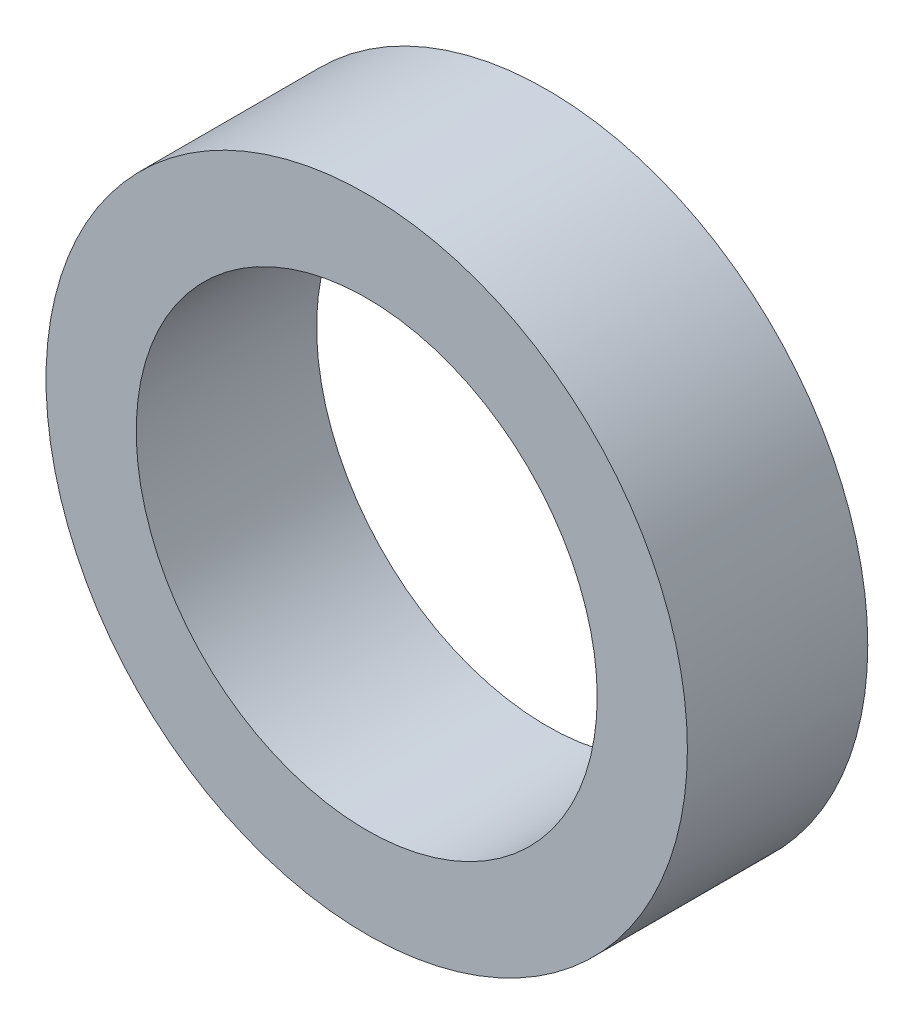
ISO-10303-21;
HEADER;
FILE_DESCRIPTION(('STEP AP214'),'2;1');
FILE_NAME('part.step','',(''),(''),'','','');
FILE_SCHEMA(('AUTOMOTIVE_DESIGN { 1 0 10303 214 1 1 1 1 }'));
ENDSEC;
DATA;
#1=APPLICATION_CONTEXT('core data for automotive mechanical design processes');
#2=APPLICATION_PROTOCOL_DEFINITION('international standard','automotive_design',2000,#1);
#3=PRODUCT_CONTEXT('',#1,'mechanical');
#4=PRODUCT('Part','Part','',(#3));
#5=PRODUCT_RELATED_PRODUCT_CATEGORY('part','',(#4));
#6=PRODUCT_DEFINITION_FORMATION('','',#4);
#7=PRODUCT_DEFINITION_CONTEXT('part definition',#1,'design');
#8=PRODUCT_DEFINITION('design','',#6,#7);
#9=PRODUCT_DEFINITION_SHAPE('','',#8);
#10=(LENGTH_UNIT() NAMED_UNIT(*) SI_UNIT(.MILLI.,.METRE.));
#11=(NAMED_UNIT(*) PLANE_ANGLE_UNIT() SI_UNIT($,.RADIAN.));
#12=(NAMED_UNIT(*) SI_UNIT($,.STERADIAN.) SOLID_ANGLE_UNIT());
#13=UNCERTAINTY_MEASURE_WITH_UNIT(LENGTH_MEASURE(1.E-05),#10,'distance_accuracy_value','');
#14=(GEOMETRIC_REPRESENTATION_CONTEXT(3) GLOBAL_UNCERTAINTY_ASSIGNED_CONTEXT((#13)) GLOBAL_UNIT_ASSIGNED_CONTEXT((#10,
#11,#12)) REPRESENTATION_CONTEXT('',''));
#15=CARTESIAN_POINT('',(0.,0.,0.));
#16=DIRECTION('',(0.,0.,1.));
#17=DIRECTION('',(1.,0.,0.));
#18=AXIS2_PLACEMENT_3D('',#15,#16,#17);
#19=CARTESIAN_POINT('',(0.,0.,9.));
#20=DIRECTION('',(0.,0.,1.));
#21=DIRECTION('',(1.,0.,0.));
#22=AXIS2_PLACEMENT_3D('',#19,#20,#21);
#23=PLANE('',#22);
#24=CARTESIAN_POINT('',(0.,0.,9.));
#25=DIRECTION('',(0.,0.,1.));
#26=DIRECTION('',(1.,0.,0.));
#27=AXIS2_PLACEMENT_3D('',#24,#25,#26);
#28=CIRCLE('',#27,16.);
#29=CARTESIAN_POINT('',(16.,0.,9.));
#30=VERTEX_POINT('',#29);
#31=EDGE_CURVE('E10',#30,#30,#28,.T.);
#32=ORIENTED_EDGE('',*,*,#31,.T.);
#33=EDGE_LOOP('',(#32));
#34=FACE_BOUND('',#33,.T.);
#35=CARTESIAN_POINT('',(0.,0.,9.));
#36=DIRECTION('',(0.,0.,1.));
#37=DIRECTION('',(1.,0.,0.));
#38=AXIS2_PLACEMENT_3D('',#35,#36,#37);
#39=CIRCLE('',#38,11.5);
#40=CARTESIAN_POINT('',(11.5,0.,9.));
#41=VERTEX_POINT('',#40);
#42=EDGE_CURVE('E42',#41,#41,#39,.T.);
#43=ORIENTED_EDGE('',*,*,#42,.F.);
#44=EDGE_LOOP('',(#43));
#45=FACE_BOUND('',#44,.T.);
#46=ADVANCED_FACE('F31',(#34,#45),#23,.T.);
#47=CARTESIAN_POINT('',(0.,0.,0.));
#48=DIRECTION('',(0.,0.,1.));
#49=DIRECTION('',(1.,0.,0.));
#50=AXIS2_PLACEMENT_3D('',#47,#48,#49);
#51=PLANE('',#50);
#52=CARTESIAN_POINT('',(0.,0.,0.));
#53=DIRECTION('',(0.,0.,1.));
#54=DIRECTION('',(1.,0.,0.));
#55=AXIS2_PLACEMENT_3D('',#52,#53,#54);
#56=CIRCLE('',#55,16.);
#57=CARTESIAN_POINT('',(16.,0.,0.));
#58=VERTEX_POINT('',#57);
#59=EDGE_CURVE('E35',#58,#58,#56,.T.);
#60=ORIENTED_EDGE('',*,*,#59,.F.);
#61=EDGE_LOOP('',(#60));
#62=FACE_BOUND('',#61,.T.);
#63=CARTESIAN_POINT('',(0.,0.,0.));
#64=DIRECTION('',(0.,0.,1.));
#65=DIRECTION('',(1.,0.,0.));
#66=AXIS2_PLACEMENT_3D('',#63,#64,#65);
#67=CIRCLE('',#66,11.5);
#68=CARTESIAN_POINT('',(11.5,0.,0.));
#69=VERTEX_POINT('',#68);
#70=EDGE_CURVE('E44',#69,#69,#67,.T.);
#71=ORIENTED_EDGE('',*,*,#70,.T.);
#72=EDGE_LOOP('',(#71));
#73=FACE_BOUND('',#72,.T.);
#74=ADVANCED_FACE('F54',(#62,#73),#51,.F.);
#75=CARTESIAN_POINT('',(0.,0.,9.));
#76=DIRECTION('',(0.,0.,-1.));
#77=DIRECTION('',(-1.,0.,0.));
#78=AXIS2_PLACEMENT_3D('',#75,#76,#77);
#79=CYLINDRICAL_SURFACE('',#78,16.);
#80=ORIENTED_EDGE('',*,*,#31,.F.);
#81=EDGE_LOOP('',(#80));
#82=FACE_BOUND('',#81,.T.);
#83=ORIENTED_EDGE('',*,*,#59,.T.);
#84=EDGE_LOOP('',(#83));
#85=FACE_BOUND('',#84,.T.);
#86=ADVANCED_FACE('F33',(#82,#85),#79,.T.);
#87=CARTESIAN_POINT('',(0.,0.,9.));
#88=DIRECTION('',(0.,0.,-1.));
#89=DIRECTION('',(-1.,0.,0.));
#90=AXIS2_PLACEMENT_3D('',#87,#88,#89);
#91=CYLINDRICAL_SURFACE('',#90,11.5);
#92=ORIENTED_EDGE('',*,*,#42,.T.);
#93=EDGE_LOOP('',(#92));
#94=FACE_BOUND('',#93,.T.);
#95=ORIENTED_EDGE('',*,*,#70,.F.);
#96=EDGE_LOOP('',(#95));
#97=FACE_BOUND('',#96,.T.);
#98=ADVANCED_FACE('F50',(#94,#97),#91,.F.);
#99=CLOSED_SHELL('',(#46,#74,#86,#98));
#100=MANIFOLD_SOLID_BREP('B2',#99);
#101=ADVANCED_BREP_SHAPE_REPRESENTATION('',(#18,#100),#14);
#102=SHAPE_DEFINITION_REPRESENTATION(#9,#101);
ENDSEC;
END-ISO-10303-21;
